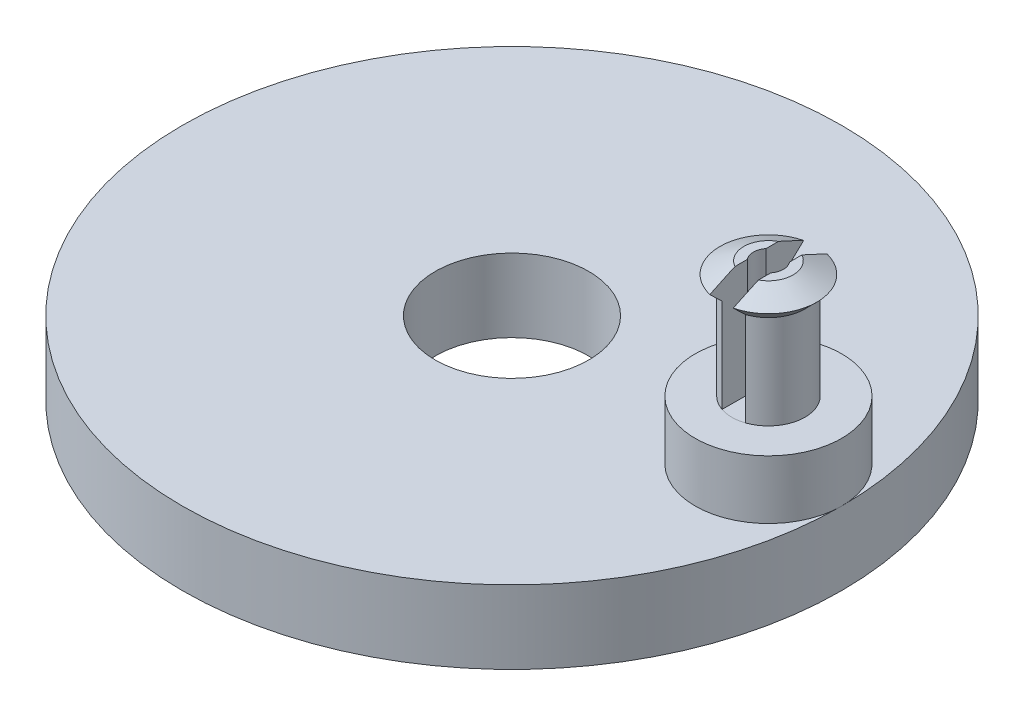
ISO-10303-21;
HEADER;
FILE_DESCRIPTION(('STEP AP214'),'2;1');
FILE_NAME('part.step','',(''),(''),'','','');
FILE_SCHEMA(('AUTOMOTIVE_DESIGN { 1 0 10303 214 1 1 1 1 }'));
ENDSEC;
DATA;
#1=APPLICATION_CONTEXT('core data for automotive mechanical design processes');
#2=APPLICATION_PROTOCOL_DEFINITION('international standard','automotive_design',2000,#1);
#3=PRODUCT_CONTEXT('',#1,'mechanical');
#4=PRODUCT('Part','Part','',(#3));
#5=PRODUCT_RELATED_PRODUCT_CATEGORY('part','',(#4));
#6=PRODUCT_DEFINITION_FORMATION('','',#4);
#7=PRODUCT_DEFINITION_CONTEXT('part definition',#1,'design');
#8=PRODUCT_DEFINITION('design','',#6,#7);
#9=PRODUCT_DEFINITION_SHAPE('','',#8);
#10=(LENGTH_UNIT() NAMED_UNIT(*) SI_UNIT(.MILLI.,.METRE.));
#11=(NAMED_UNIT(*) PLANE_ANGLE_UNIT() SI_UNIT($,.RADIAN.));
#12=(NAMED_UNIT(*) SI_UNIT($,.STERADIAN.) SOLID_ANGLE_UNIT());
#13=UNCERTAINTY_MEASURE_WITH_UNIT(LENGTH_MEASURE(1.E-05),#10,'distance_accuracy_value','');
#14=(GEOMETRIC_REPRESENTATION_CONTEXT(3) GLOBAL_UNCERTAINTY_ASSIGNED_CONTEXT((#13)) GLOBAL_UNIT_ASSIGNED_CONTEXT((#10,
#11,#12)) REPRESENTATION_CONTEXT('',''));
#15=CARTESIAN_POINT('',(0.,0.,0.));
#16=DIRECTION('',(0.,0.,1.));
#17=DIRECTION('',(1.,0.,0.));
#18=AXIS2_PLACEMENT_3D('',#15,#16,#17);
#19=CARTESIAN_POINT('',(11.1125,10.795,0.));
#20=DIRECTION('',(0.,-1.,0.));
#21=DIRECTION('',(0.,0.,-1.));
#22=AXIS2_PLACEMENT_3D('',#19,#20,#21);
#23=CONICAL_SURFACE('',#22,1.06838306981119,1.11024189471253);
#24=CARTESIAN_POINT('',(11.1125,10.2854067329982,0.));
#25=DIRECTION('',(0.,-1.,0.));
#26=DIRECTION('',(0.,0.,-1.));
#27=AXIS2_PLACEMENT_3D('',#24,#25,#26);
#28=CIRCLE('',#27,2.0955);
#29=CARTESIAN_POINT('',(11.6205,10.2854067329982,-2.03299194538493));
#30=VERTEX_POINT('',#29);
#31=CARTESIAN_POINT('',(11.6205,10.2854067329982,2.03299194538493));
#32=VERTEX_POINT('',#31);
#33=EDGE_CURVE('E272',#30,#32,#28,.T.);
#34=ORIENTED_EDGE('',*,*,#33,.F.);
#35=CARTESIAN_POINT('',(11.6205,10.2847067329982,-2.03444618888505));
#36=CARTESIAN_POINT('',(11.6205,10.333570793799,-1.93286572050983));
#37=CARTESIAN_POINT('',(11.6205,10.3823118411642,-1.83122531488033));
#38=CARTESIAN_POINT('',(11.6205,10.4792659184686,-1.6275870846532));
#39=CARTESIAN_POINT('',(11.6205,10.5274784630361,-1.52558902927974));
#40=CARTESIAN_POINT('',(11.6205,10.6269471427818,-1.31274399531558));
#41=CARTESIAN_POINT('',(11.6205,10.678126500503,-1.20186076137682));
#42=CARTESIAN_POINT('',(11.6205,10.753237891018,-1.03482340438307));
#43=CARTESIAN_POINT('',(11.6205,10.7779924345718,-0.979040344849807));
#44=CARTESIAN_POINT('',(11.6205,10.8266507037249,-0.867105619351564));
#45=CARTESIAN_POINT('',(11.6205,10.8505544787263,-0.810953975014432));
#46=CARTESIAN_POINT('',(11.6205,10.895177922838,-0.702529847055119));
#47=CARTESIAN_POINT('',(11.6205,10.9160001241908,-0.650299896386952));
#48=CARTESIAN_POINT('',(11.6205,10.9557888044178,-0.545060695002858));
#49=CARTESIAN_POINT('',(11.6205,10.9747533081388,-0.492050682305445));
#50=CARTESIAN_POINT('',(11.6205,11.0090157604214,-0.386392469416067));
#51=CARTESIAN_POINT('',(11.6205,11.0243980913441,-0.333772403737377));
#52=CARTESIAN_POINT('',(11.6205,11.0499059819571,-0.227285184285446));
#53=CARTESIAN_POINT('',(11.6205,11.0600430441358,-0.173421032218853));
#54=CARTESIAN_POINT('',(11.6205,11.0701590935038,-0.084083145820786));
#55=CARTESIAN_POINT('',(11.6205,11.0724686707629,-0.0488824873937726));
#56=CARTESIAN_POINT('',(11.6205,11.0734054733717,0.0215634040339679));
#57=CARTESIAN_POINT('',(11.6205,11.0720335771374,0.0568086243962584));
#58=CARTESIAN_POINT('',(11.6205,11.0658179915808,0.127249171188504));
#59=CARTESIAN_POINT('',(11.6205,11.0609476209143,0.162442018611823));
#60=CARTESIAN_POINT('',(11.6205,11.0483944055774,0.232328754243884));
#61=CARTESIAN_POINT('',(11.6205,11.0407094878879,0.267022255040229));
#62=CARTESIAN_POINT('',(11.6205,11.0238477215426,0.333624653460089));
#63=CARTESIAN_POINT('',(11.6205,11.0148010917834,0.365567430826599));
#64=CARTESIAN_POINT('',(11.6205,10.9953936809588,0.429054875353098));
#65=CARTESIAN_POINT('',(11.6205,10.9850325463566,0.46059943289285));
#66=CARTESIAN_POINT('',(11.6205,10.9525258759844,0.554814550505991));
#67=CARTESIAN_POINT('',(11.6205,10.928976804494,0.616996021917201));
#68=CARTESIAN_POINT('',(11.6205,10.8798120517533,0.74073216843469));
#69=CARTESIAN_POINT('',(11.6205,10.8541902835962,0.802284351897531));
#70=CARTESIAN_POINT('',(11.6205,10.8017790836246,0.924840876617647));
#71=CARTESIAN_POINT('',(11.6205,10.7749904210066,0.985845547728909));
#72=CARTESIAN_POINT('',(11.6205,10.720468891218,1.10799223700858));
#73=CARTESIAN_POINT('',(11.6205,10.6927303470935,1.16913170349966));
#74=CARTESIAN_POINT('',(11.6205,10.6367540273605,1.29119304744235));
#75=CARTESIAN_POINT('',(11.6205,10.6085161727665,1.35211488860228));
#76=CARTESIAN_POINT('',(11.6205,10.5233908644956,1.53445482063145));
#77=CARTESIAN_POINT('',(11.6205,10.4660044484333,1.65563962004577));
#78=CARTESIAN_POINT('',(11.6205,10.3877193745102,1.81974003583962));
#79=CARTESIAN_POINT('',(11.6205,10.3671230134028,1.86280089048256));
#80=CARTESIAN_POINT('',(11.6205,10.3259303739592,1.94872817670271));
#81=CARTESIAN_POINT('',(11.6205,10.3053343732938,1.99159474137553));
#82=CARTESIAN_POINT('',(11.6205,10.2847067329982,2.03444618888505));
#83=B_SPLINE_CURVE_WITH_KNOTS('',3,(#35,#36,#37,#38,#39,#40,#41,#42,#43,#44,#45,#46,#47,#48,#49,
#50,#51,#52,#53,#54,#55,#56,#57,#58,#59,#60,#61,#62,#63,#64,#65,#66,#67,#68,#69,#70,#71,#72,#73,
#74,#75,#76,#77,#78,#79,#80,#81,#82),.UNSPECIFIED.,.F.,.F.,(4,2,2,2,2,2,2,2,2,2,2,2,2,2,2,2,2,2,
2,2,2,2,2,4),(0.,0.338166972860301,0.676622130163528,1.04298101846566,1.22606388684639,
1.40913610663749,1.57779917604537,1.74663966915867,1.91097180659485,2.07494203196178,
2.18059199081132,2.28621674335168,2.39265572103193,2.49917325317483,2.59873405412885,
2.69832168900197,2.89771624429507,3.09771924459875,3.29759234454449,3.49900254295994,
3.70044489247477,4.1026961712963,4.24589547287104,4.38856869846006),.UNSPECIFIED.);
#84=CARTESIAN_POINT('',(11.6205,10.795,-0.939882111681667));
#85=VERTEX_POINT('',#84);
#86=EDGE_CURVE('E360',#30,#85,#83,.T.);
#87=ORIENTED_EDGE('',*,*,#86,.T.);
#88=CARTESIAN_POINT('',(11.1125,10.795,0.));
#89=DIRECTION('',(0.,-1.,0.));
#90=DIRECTION('',(0.,0.,-1.));
#91=AXIS2_PLACEMENT_3D('',#88,#89,#90);
#92=CIRCLE('',#91,1.06838306981119);
#93=CARTESIAN_POINT('',(11.6205,10.795,0.939882111681667));
#94=VERTEX_POINT('',#93);
#95=EDGE_CURVE('E286',#85,#94,#92,.T.);
#96=ORIENTED_EDGE('',*,*,#95,.T.);
#97=EDGE_CURVE('E350',#94,#32,#83,.T.);
#98=ORIENTED_EDGE('',*,*,#97,.T.);
#99=EDGE_LOOP('',(#34,#87,#96,#98));
#100=FACE_BOUND('',#99,.T.);
#101=ADVANCED_FACE('F39',(#100),#23,.T.);
#102=CARTESIAN_POINT('',(11.1125,10.2854067329982,0.));
#103=DIRECTION('',(0.,1.,0.));
#104=DIRECTION('',(0.,0.,1.));
#105=AXIS2_PLACEMENT_3D('',#102,#103,#104);
#106=CONICAL_SURFACE('',#105,2.0955,0.786968801327761);
#107=ORIENTED_EDGE('',*,*,#33,.T.);
#108=CARTESIAN_POINT('',(11.6205,10.2861067329982,2.03371573066489));
#109=CARTESIAN_POINT('',(11.6205,10.2391831440636,1.98519593448692));
#110=CARTESIAN_POINT('',(11.6205,10.1923080827223,1.9366290154971));
#111=CARTESIAN_POINT('',(11.6205,10.0986846424886,1.83937169207284));
#112=CARTESIAN_POINT('',(11.6205,10.0519362657207,1.79068128559375));
#113=CARTESIAN_POINT('',(11.6205,9.91185417935172,1.64430631760241));
#114=CARTESIAN_POINT('',(11.6205,9.81875778289134,1.54639461348666));
#115=CARTESIAN_POINT('',(11.6205,9.6318945900217,1.34776583074746));
#116=CARTESIAN_POINT('',(11.6205,9.5381472007048,1.24703034745993));
#117=CARTESIAN_POINT('',(11.6205,9.39915126609169,1.09447892296673));
#118=CARTESIAN_POINT('',(11.6205,9.35309876682968,1.04339695323211));
#119=CARTESIAN_POINT('',(11.6205,9.26180541906299,0.940514371707628));
#120=CARTESIAN_POINT('',(11.6205,9.21656451629374,0.888713808377776));
#121=CARTESIAN_POINT('',(11.6205,9.14250236684547,0.801782890584742));
#122=CARTESIAN_POINT('',(11.6205,9.11331948933075,0.766961429899956));
#123=CARTESIAN_POINT('',(11.6205,9.05574057156134,0.696651836918109));
#124=CARTESIAN_POINT('',(11.6205,9.02734478007161,0.661163499663936));
#125=CARTESIAN_POINT('',(11.6205,8.97178459194898,0.589352163528586));
#126=CARTESIAN_POINT('',(11.6205,8.94461766558819,0.553031135228383));
#127=CARTESIAN_POINT('',(11.6205,8.89209778401023,0.479110630019341));
#128=CARTESIAN_POINT('',(11.6205,8.86674372129378,0.441511954715621));
#129=CARTESIAN_POINT('',(11.6205,8.82180033906405,0.368968513404946));
#130=CARTESIAN_POINT('',(11.6205,8.80188367532777,0.334229984325404));
#131=CARTESIAN_POINT('',(11.6205,8.7658136403258,0.262807668487352));
#132=CARTESIAN_POINT('',(11.6205,8.7496562890096,0.22612598997191));
#133=CARTESIAN_POINT('',(11.6205,8.72621969050067,0.158457620437535));
#134=CARTESIAN_POINT('',(11.6205,8.71779008193544,0.127885731792567));
#135=CARTESIAN_POINT('',(11.6205,8.70621967661815,0.0657938225693621));
#136=CARTESIAN_POINT('',(11.6205,8.70306217973946,0.034277118993749));
#137=CARTESIAN_POINT('',(11.6205,8.70272330050501,-0.0289158865190598));
#138=CARTESIAN_POINT('',(11.6205,8.70556567509996,-0.0605923256015666));
#139=CARTESIAN_POINT('',(11.6205,8.71661225688154,-0.123021171580938));
#140=CARTESIAN_POINT('',(11.6205,8.72483102904133,-0.153770830382573));
#141=CARTESIAN_POINT('',(11.6205,8.74599263395935,-0.216183189465512));
#142=CARTESIAN_POINT('',(11.6205,8.75924995453181,-0.2477344704047));
#143=CARTESIAN_POINT('',(11.6205,8.78880538126506,-0.309403706506788));
#144=CARTESIAN_POINT('',(11.6205,8.80510934794674,-0.339518756393992));
#145=CARTESIAN_POINT('',(11.6205,8.83984568622969,-0.39880345938415));
#146=CARTESIAN_POINT('',(11.6205,8.85829429441422,-0.427963427971164));
#147=CARTESIAN_POINT('',(11.6205,8.89653361729393,-0.485339790479753));
#148=CARTESIAN_POINT('',(11.6205,8.91632308988147,-0.51355702247519));
#149=CARTESIAN_POINT('',(11.6205,8.95874739121341,-0.571914746291205));
#150=CARTESIAN_POINT('',(11.6205,8.98147498767663,-0.601987332617881));
#151=CARTESIAN_POINT('',(11.6205,9.0277245800409,-0.661517424187673));
#152=CARTESIAN_POINT('',(11.6205,9.0512466793402,-0.690974848558765));
#153=CARTESIAN_POINT('',(11.6205,9.12268257028246,-0.778681568791406));
#154=CARTESIAN_POINT('',(11.6205,9.1714450280798,-0.836237485046786));
#155=CARTESIAN_POINT('',(11.6205,9.27032415026797,-0.950330846226255));
#156=CARTESIAN_POINT('',(11.6205,9.32044296906357,-1.0068664003797));
#157=CARTESIAN_POINT('',(11.6205,9.42147504696845,-1.11919366675139));
#158=CARTESIAN_POINT('',(11.6205,9.47238808238651,-1.17498558049021));
#159=CARTESIAN_POINT('',(11.6205,9.57458586586735,-1.28589587191143));
#160=CARTESIAN_POINT('',(11.6205,9.62586889806846,-1.3410158358787));
#161=CARTESIAN_POINT('',(11.6205,9.72881339353525,-1.45090790706735));
#162=CARTESIAN_POINT('',(11.6205,9.78047488254632,-1.50567999014115));
#163=CARTESIAN_POINT('',(11.6205,9.93578448855455,-1.66953327861249));
#164=CARTESIAN_POINT('',(11.6205,10.0398341198792,-1.77823370067565));
#165=CARTESIAN_POINT('',(11.6205,10.167808792583,-1.91117949371458));
#166=CARTESIAN_POINT('',(11.6205,10.1914458566905,-1.93570352301899));
#167=CARTESIAN_POINT('',(11.6205,10.2387530537852,-1.98472791212922));
#168=CARTESIAN_POINT('',(11.6205,10.2624231918129,-2.00922826707115));
#169=CARTESIAN_POINT('',(11.6205,10.2861067329982,-2.03371573066489));
#170=B_SPLINE_CURVE_WITH_KNOTS('',3,(#108,#109,#110,#111,#112,#113,#114,#115,#116,#117,#118,
#119,#120,#121,#122,#123,#124,#125,#126,#127,#128,#129,#130,#131,#132,#133,#134,#135,#136,#137,
#138,#139,#140,#141,#142,#143,#144,#145,#146,#147,#148,#149,#150,#151,#152,#153,#154,#155,#156,
#157,#158,#159,#160,#161,#162,#163,#164,#165,#166,#167,#168,#169),.UNSPECIFIED.,.F.,.F.,(4,2,2,
2,2,2,2,2,2,2,2,2,2,2,2,2,2,2,2,2,2,2,2,2,2,2,2,2,2,2,4),(0.,0.202494492557057,
0.404992360095032,0.810308181472409,1.22311463361278,1.4294392431596,1.63575000572656,
1.77204186855466,1.90837632740143,2.04441600888086,2.18037185922292,2.30037547247225,
2.42025145170826,2.5150390306853,2.6095257835775,2.70438736564834,2.79950700347133,
2.90193612341352,3.00456434277523,3.10802749650799,3.21139608413516,3.32446186102749,
3.43754240966561,3.6638078732506,3.89045668939248,4.11704278289128,4.34290216730352,
4.56877706169052,5.02019030179422,5.12237276440143,5.22457301597904),.UNSPECIFIED.);
#171=CARTESIAN_POINT('',(11.6205,9.779,1.50402534885553));
#172=VERTEX_POINT('',#171);
#173=EDGE_CURVE('E351',#32,#172,#170,.T.);
#174=ORIENTED_EDGE('',*,*,#173,.T.);
#175=CARTESIAN_POINT('',(11.1125,9.779,0.));
#176=DIRECTION('',(0.,-1.,0.));
#177=DIRECTION('',(0.,0.,-1.));
#178=AXIS2_PLACEMENT_3D('',#175,#176,#177);
#179=CIRCLE('',#178,1.5875);
#180=CARTESIAN_POINT('',(11.6205,9.779,-1.50402534885553));
#181=VERTEX_POINT('',#180);
#182=EDGE_CURVE('E276',#181,#172,#179,.T.);
#183=ORIENTED_EDGE('',*,*,#182,.F.);
#184=EDGE_CURVE('E368',#181,#30,#170,.T.);
#185=ORIENTED_EDGE('',*,*,#184,.T.);
#186=EDGE_LOOP('',(#107,#174,#183,#185));
#187=FACE_BOUND('',#186,.T.);
#188=ADVANCED_FACE('F435',(#187),#106,.T.);
#189=CARTESIAN_POINT('',(11.1125,3.175,0.));
#190=DIRECTION('',(0.,-1.,0.));
#191=DIRECTION('',(0.,0.,-1.));
#192=AXIS2_PLACEMENT_3D('',#189,#190,#191);
#193=CYLINDRICAL_SURFACE('',#192,1.5875);
#194=ORIENTED_EDGE('',*,*,#182,.T.);
#195=DIRECTION('',(0.,-1.,0.));
#196=VECTOR('',#195,1.);
#197=CARTESIAN_POINT('',(11.6205,3.175,1.50402534885553));
#198=LINE('',#197,#196);
#199=CARTESIAN_POINT('',(11.6204908399416,5.71092127573175,1.50405849005337));
#200=VERTEX_POINT('',#199);
#201=EDGE_CURVE('E364',#172,#200,#198,.T.);
#202=ORIENTED_EDGE('',*,*,#201,.T.);
#203=CARTESIAN_POINT('',(11.1125,5.715,0.));
#204=DIRECTION('',(0.,-1.,0.));
#205=DIRECTION('',(0.,0.,-1.));
#206=AXIS2_PLACEMENT_3D('',#203,#204,#205);
#207=CIRCLE('',#206,1.5875);
#208=CARTESIAN_POINT('',(11.6204943975401,5.71091753510502,-1.504045667974));
#209=VERTEX_POINT('',#208);
#210=EDGE_CURVE('E190',#209,#200,#207,.T.);
#211=ORIENTED_EDGE('',*,*,#210,.F.);
#212=DIRECTION('',(0.,-1.,0.));
#213=VECTOR('',#212,1.);
#214=CARTESIAN_POINT('',(11.6205,3.175,-1.50402534885553));
#215=LINE('',#214,#213);
#216=EDGE_CURVE('E159',#209,#181,#215,.F.);
#217=ORIENTED_EDGE('',*,*,#216,.T.);
#218=EDGE_LOOP('',(#194,#202,#211,#217));
#219=FACE_BOUND('',#218,.T.);
#220=ADVANCED_FACE('F436',(#219),#193,.T.);
#221=CARTESIAN_POINT('',(10.0441169301888,10.795,0.));
#222=DIRECTION('',(0.,-1.,0.));
#223=DIRECTION('',(0.,0.,-1.));
#224=AXIS2_PLACEMENT_3D('',#221,#222,#223);
#225=PLANE('',#224);
#226=ORIENTED_EDGE('',*,*,#95,.F.);
#227=DIRECTION('',(0.,0.,1.));
#228=VECTOR('',#227,1.);
#229=CARTESIAN_POINT('',(11.6205,10.795,0.));
#230=LINE('',#229,#228);
#231=CARTESIAN_POINT('',(11.6205,10.795,-0.404663408831457));
#232=VERTEX_POINT('',#231);
#233=EDGE_CURVE('E255',#85,#232,#230,.T.);
#234=ORIENTED_EDGE('',*,*,#233,.T.);
#235=CARTESIAN_POINT('',(11.1125,10.795,0.));
#236=DIRECTION('',(0.,-1.,0.));
#237=DIRECTION('',(0.,0.,-1.));
#238=AXIS2_PLACEMENT_3D('',#235,#236,#237);
#239=CIRCLE('',#238,0.649473998284068);
#240=CARTESIAN_POINT('',(11.6205,10.795,0.404663408831457));
#241=VERTEX_POINT('',#240);
#242=EDGE_CURVE('E284',#232,#241,#239,.T.);
#243=ORIENTED_EDGE('',*,*,#242,.T.);
#244=EDGE_CURVE('E254',#241,#94,#230,.T.);
#245=ORIENTED_EDGE('',*,*,#244,.T.);
#246=EDGE_LOOP('',(#226,#234,#243,#245));
#247=FACE_BOUND('',#246,.T.);
#248=ADVANCED_FACE('F390',(#247),#225,.F.);
#249=CARTESIAN_POINT('',(0.,3.175,0.));
#250=DIRECTION('',(0.,1.,0.));
#251=DIRECTION('',(0.,0.,1.));
#252=AXIS2_PLACEMENT_3D('',#249,#250,#251);
#253=PLANE('',#252);
#254=CARTESIAN_POINT('',(0.,3.175,0.));
#255=DIRECTION('',(0.,1.,0.));
#256=DIRECTION('',(0.,0.,1.));
#257=AXIS2_PLACEMENT_3D('',#254,#255,#256);
#258=CIRCLE('',#257,14.2875);
#259=CARTESIAN_POINT('',(14.2875,3.175,0.));
#260=VERTEX_POINT('',#259);
#261=EDGE_CURVE('E266',#260,#260,#258,.T.);
#262=ORIENTED_EDGE('',*,*,#261,.T.);
#263=CARTESIAN_POINT('',(11.1125,3.175,0.));
#264=DIRECTION('',(0.,-1.,0.));
#265=DIRECTION('',(0.,0.,-1.));
#266=AXIS2_PLACEMENT_3D('',#263,#264,#265);
#267=CIRCLE('',#266,3.175);
#268=EDGE_CURVE('E236',#260,#260,#267,.T.);
#269=ORIENTED_EDGE('',*,*,#268,.T.);
#270=EDGE_LOOP('',(#262,#269));
#271=FACE_BOUND('',#270,.T.);
#272=CARTESIAN_POINT('',(0.,3.175,0.));
#273=DIRECTION('',(0.,1.,0.));
#274=DIRECTION('',(0.,0.,1.));
#275=AXIS2_PLACEMENT_3D('',#272,#273,#274);
#276=CIRCLE('',#275,3.3274);
#277=CARTESIAN_POINT('',(0.,3.175,3.3274));
#278=VERTEX_POINT('',#277);
#279=EDGE_CURVE('E270',#278,#278,#276,.T.);
#280=ORIENTED_EDGE('',*,*,#279,.F.);
#281=EDGE_LOOP('',(#280));
#282=FACE_BOUND('',#281,.T.);
#283=ADVANCED_FACE('F427',(#271,#282),#253,.T.);
#284=CARTESIAN_POINT('',(0.,0.,0.));
#285=DIRECTION('',(0.,1.,0.));
#286=DIRECTION('',(0.,0.,1.));
#287=AXIS2_PLACEMENT_3D('',#284,#285,#286);
#288=PLANE('',#287);
#289=CARTESIAN_POINT('',(0.,0.,0.));
#290=DIRECTION('',(0.,1.,0.));
#291=DIRECTION('',(0.,0.,1.));
#292=AXIS2_PLACEMENT_3D('',#289,#290,#291);
#293=CIRCLE('',#292,14.2875);
#294=CARTESIAN_POINT('',(0.,0.,14.2875));
#295=VERTEX_POINT('',#294);
#296=EDGE_CURVE('E263',#295,#295,#293,.T.);
#297=ORIENTED_EDGE('',*,*,#296,.F.);
#298=EDGE_LOOP('',(#297));
#299=FACE_BOUND('',#298,.T.);
#300=CARTESIAN_POINT('',(0.,0.,0.));
#301=DIRECTION('',(0.,1.,0.));
#302=DIRECTION('',(0.,0.,1.));
#303=AXIS2_PLACEMENT_3D('',#300,#301,#302);
#304=CIRCLE('',#303,3.3274);
#305=CARTESIAN_POINT('',(0.,0.,3.3274));
#306=VERTEX_POINT('',#305);
#307=EDGE_CURVE('E269',#306,#306,#304,.T.);
#308=ORIENTED_EDGE('',*,*,#307,.T.);
#309=EDGE_LOOP('',(#308));
#310=FACE_BOUND('',#309,.T.);
#311=ADVANCED_FACE('F567',(#299,#310),#288,.F.);
#312=CARTESIAN_POINT('',(0.,3.175,0.));
#313=DIRECTION('',(0.,-1.,0.));
#314=DIRECTION('',(0.,0.,-1.));
#315=AXIS2_PLACEMENT_3D('',#312,#313,#314);
#316=CYLINDRICAL_SURFACE('',#315,14.2875);
#317=ORIENTED_EDGE('',*,*,#261,.F.);
#318=EDGE_LOOP('',(#317));
#319=FACE_BOUND('',#318,.T.);
#320=ORIENTED_EDGE('',*,*,#296,.T.);
#321=EDGE_LOOP('',(#320));
#322=FACE_BOUND('',#321,.T.);
#323=ADVANCED_FACE('F41',(#319,#322),#316,.T.);
#324=CARTESIAN_POINT('',(0.,3.175,0.));
#325=DIRECTION('',(0.,-1.,0.));
#326=DIRECTION('',(0.,0.,-1.));
#327=AXIS2_PLACEMENT_3D('',#324,#325,#326);
#328=CYLINDRICAL_SURFACE('',#327,3.3274);
#329=ORIENTED_EDGE('',*,*,#279,.T.);
#330=EDGE_LOOP('',(#329));
#331=FACE_BOUND('',#330,.T.);
#332=ORIENTED_EDGE('',*,*,#307,.F.);
#333=EDGE_LOOP('',(#332));
#334=FACE_BOUND('',#333,.T.);
#335=ADVANCED_FACE('F342',(#331,#334),#328,.F.);
#336=CARTESIAN_POINT('',(10.6045,10.2854067329982,2.03299194538493));
#337=VERTEX_POINT('',#336);
#338=CARTESIAN_POINT('',(10.6045,10.2854067329982,-2.03299194538493));
#339=VERTEX_POINT('',#338);
#340=EDGE_CURVE('E279',#337,#339,#28,.T.);
#341=ORIENTED_EDGE('',*,*,#340,.F.);
#342=CARTESIAN_POINT('',(10.6045,10.2847067329982,2.03444618888504));
#343=CARTESIAN_POINT('',(10.6045,10.333570793799,1.93286572050983));
#344=CARTESIAN_POINT('',(10.6045,10.3823118411642,1.83122531488033));
#345=CARTESIAN_POINT('',(10.6045,10.4792659184686,1.6275870846532));
#346=CARTESIAN_POINT('',(10.6045,10.5274784630361,1.52558902927974));
#347=CARTESIAN_POINT('',(10.6045,10.6269471427818,1.31274399531558));
#348=CARTESIAN_POINT('',(10.6045,10.678126500503,1.20186076137683));
#349=CARTESIAN_POINT('',(10.6045,10.753237891018,1.03482340438307));
#350=CARTESIAN_POINT('',(10.6045,10.7779924345718,0.979040344849808));
#351=CARTESIAN_POINT('',(10.6045,10.8266507037249,0.867105619351565));
#352=CARTESIAN_POINT('',(10.6045,10.8505544787263,0.810953975014434));
#353=CARTESIAN_POINT('',(10.6045,10.895177922838,0.70252984705512));
#354=CARTESIAN_POINT('',(10.6045,10.9160001241908,0.650299896386953));
#355=CARTESIAN_POINT('',(10.6045,10.9557888044178,0.545060695002859));
#356=CARTESIAN_POINT('',(10.6045,10.9747533081388,0.492050682305447));
#357=CARTESIAN_POINT('',(10.6045,11.0090157604214,0.386392469416069));
#358=CARTESIAN_POINT('',(10.6045,11.0243980913441,0.333772403737378));
#359=CARTESIAN_POINT('',(10.6045,11.0499059819571,0.227285184285448));
#360=CARTESIAN_POINT('',(10.6045,11.0600430441358,0.173421032218853));
#361=CARTESIAN_POINT('',(10.6045,11.0701590935038,0.0840831458207863));
#362=CARTESIAN_POINT('',(10.6045,11.0724686707629,0.0488824873937727));
#363=CARTESIAN_POINT('',(10.6045,11.0734054733717,-0.0215634040339682));
#364=CARTESIAN_POINT('',(10.6045,11.0720335771374,-0.0568086243962589));
#365=CARTESIAN_POINT('',(10.6045,11.0658179915808,-0.127249171188504));
#366=CARTESIAN_POINT('',(10.6045,11.0609476209143,-0.162442018611823));
#367=CARTESIAN_POINT('',(10.6045,11.0483944055774,-0.232328754243885));
#368=CARTESIAN_POINT('',(10.6045,11.0407094878879,-0.26702225504023));
#369=CARTESIAN_POINT('',(10.6045,11.0238477215426,-0.333624653460091));
#370=CARTESIAN_POINT('',(10.6045,11.0148010917834,-0.365567430826601));
#371=CARTESIAN_POINT('',(10.6045,10.9953936809588,-0.4290548753531));
#372=CARTESIAN_POINT('',(10.6045,10.9850325463566,-0.460599432892853));
#373=CARTESIAN_POINT('',(10.6045,10.9525258759844,-0.554814550505995));
#374=CARTESIAN_POINT('',(10.6045,10.928976804494,-0.616996021917204));
#375=CARTESIAN_POINT('',(10.6045,10.8798120517533,-0.740732168434694));
#376=CARTESIAN_POINT('',(10.6045,10.8541902835962,-0.802284351897536));
#377=CARTESIAN_POINT('',(10.6045,10.8017790836246,-0.924840876617652));
#378=CARTESIAN_POINT('',(10.6045,10.7749904210066,-0.985845547728913));
#379=CARTESIAN_POINT('',(10.6045,10.720468891218,-1.10799223700858));
#380=CARTESIAN_POINT('',(10.6045,10.6927303470935,-1.16913170349967));
#381=CARTESIAN_POINT('',(10.6045,10.6367540273605,-1.29119304744236));
#382=CARTESIAN_POINT('',(10.6045,10.6085161727665,-1.35211488860229));
#383=CARTESIAN_POINT('',(10.6045,10.5233908644956,-1.53445482063146));
#384=CARTESIAN_POINT('',(10.6045,10.4660044484333,-1.65563962004578));
#385=CARTESIAN_POINT('',(10.6045,10.3877193745102,-1.81974003583962));
#386=CARTESIAN_POINT('',(10.6045,10.3671230134028,-1.86280089048256));
#387=CARTESIAN_POINT('',(10.6045,10.3259303739592,-1.94872817670271));
#388=CARTESIAN_POINT('',(10.6045,10.3053343732938,-1.99159474137553));
#389=CARTESIAN_POINT('',(10.6045,10.2847067329982,-2.03444618888504));
#390=B_SPLINE_CURVE_WITH_KNOTS('',3,(#342,#343,#344,#345,#346,#347,#348,#349,#350,#351,#352,
#353,#354,#355,#356,#357,#358,#359,#360,#361,#362,#363,#364,#365,#366,#367,#368,#369,#370,#371,
#372,#373,#374,#375,#376,#377,#378,#379,#380,#381,#382,#383,#384,#385,#386,#387,#388,#389),
.UNSPECIFIED.,.F.,.F.,(4,2,2,2,2,2,2,2,2,2,2,2,2,2,2,2,2,2,2,2,2,2,2,4),(0.,0.338166972860301,
0.676622130163527,1.04298101846566,1.22606388684638,1.40913610663749,1.57779917604537,
1.74663966915866,1.91097180659485,2.07494203196178,2.18059199081132,2.28621674335168,
2.39265572103193,2.49917325317483,2.59873405412885,2.69832168900197,2.89771624429508,
3.09771924459875,3.29759234454449,3.49900254295994,3.70044489247478,4.1026961712963,
4.24589547287104,4.38856869846006),.UNSPECIFIED.);
#391=CARTESIAN_POINT('',(10.6045,10.795,0.939882111681665));
#392=VERTEX_POINT('',#391);
#393=EDGE_CURVE('E331',#337,#392,#390,.T.);
#394=ORIENTED_EDGE('',*,*,#393,.T.);
#395=CARTESIAN_POINT('',(10.6045,10.795,-0.939882111681665));
#396=VERTEX_POINT('',#395);
#397=EDGE_CURVE('E291',#392,#396,#92,.T.);
#398=ORIENTED_EDGE('',*,*,#397,.T.);
#399=EDGE_CURVE('E326',#396,#339,#390,.T.);
#400=ORIENTED_EDGE('',*,*,#399,.T.);
#401=EDGE_LOOP('',(#341,#394,#398,#400));
#402=FACE_BOUND('',#401,.T.);
#403=ADVANCED_FACE('F337',(#402),#23,.T.);
#404=ORIENTED_EDGE('',*,*,#340,.T.);
#405=CARTESIAN_POINT('',(10.6045,10.2861067329982,-2.03371573066489));
#406=CARTESIAN_POINT('',(10.6045,10.2391831440636,-1.98519593448692));
#407=CARTESIAN_POINT('',(10.6045,10.1923080827223,-1.9366290154971));
#408=CARTESIAN_POINT('',(10.6045,10.0986846424886,-1.83937169207284));
#409=CARTESIAN_POINT('',(10.6045,10.0519362657207,-1.79068128559375));
#410=CARTESIAN_POINT('',(10.6045,9.91185417935173,-1.64430631760241));
#411=CARTESIAN_POINT('',(10.6045,9.81875778289134,-1.54639461348666));
#412=CARTESIAN_POINT('',(10.6045,9.63189459002171,-1.34776583074746));
#413=CARTESIAN_POINT('',(10.6045,9.5381472007048,-1.24703034745994));
#414=CARTESIAN_POINT('',(10.6045,9.39915126609169,-1.09447892296673));
#415=CARTESIAN_POINT('',(10.6045,9.35309876682969,-1.04339695323211));
#416=CARTESIAN_POINT('',(10.6045,9.261805419063,-0.940514371707635));
#417=CARTESIAN_POINT('',(10.6045,9.21656451629375,-0.888713808377783));
#418=CARTESIAN_POINT('',(10.6045,9.14250236684548,-0.801782890584751));
#419=CARTESIAN_POINT('',(10.6045,9.11331948933075,-0.766961429899964));
#420=CARTESIAN_POINT('',(10.6045,9.05574057156135,-0.696651836918118));
#421=CARTESIAN_POINT('',(10.6045,9.02734478007162,-0.661163499663945));
#422=CARTESIAN_POINT('',(10.6045,8.97178459194899,-0.589352163528597));
#423=CARTESIAN_POINT('',(10.6045,8.9446176655882,-0.553031135228394));
#424=CARTESIAN_POINT('',(10.6045,8.89209778401024,-0.479110630019353));
#425=CARTESIAN_POINT('',(10.6045,8.86674372129379,-0.441511954715634));
#426=CARTESIAN_POINT('',(10.6045,8.82180033906406,-0.368968513404958));
#427=CARTESIAN_POINT('',(10.6045,8.80188367532778,-0.334229984325415));
#428=CARTESIAN_POINT('',(10.6045,8.76581364032581,-0.262807668487363));
#429=CARTESIAN_POINT('',(10.6045,8.74965628900961,-0.22612598997192));
#430=CARTESIAN_POINT('',(10.6045,8.72621969050067,-0.158457620437544));
#431=CARTESIAN_POINT('',(10.6045,8.71779008193545,-0.127885731792577));
#432=CARTESIAN_POINT('',(10.6045,8.70621967661815,-0.0657938225693707));
#433=CARTESIAN_POINT('',(10.6045,8.70306217973947,-0.0342771189937571));
#434=CARTESIAN_POINT('',(10.6045,8.70272330050501,0.0289158865190526));
#435=CARTESIAN_POINT('',(10.6045,8.70556567509996,0.0605923256015598));
#436=CARTESIAN_POINT('',(10.6045,8.71661225688154,0.123021171580932));
#437=CARTESIAN_POINT('',(10.6045,8.72483102904133,0.153770830382568));
#438=CARTESIAN_POINT('',(10.6045,8.74599263395935,0.216183189465506));
#439=CARTESIAN_POINT('',(10.6045,8.75924995453181,0.247734470404693));
#440=CARTESIAN_POINT('',(10.6045,8.78880538126506,0.30940370650678));
#441=CARTESIAN_POINT('',(10.6045,8.80510934794674,0.339518756393983));
#442=CARTESIAN_POINT('',(10.6045,8.83984568622969,0.39880345938414));
#443=CARTESIAN_POINT('',(10.6045,8.85829429441421,0.427963427971153));
#444=CARTESIAN_POINT('',(10.6045,8.89653361729393,0.485339790479741));
#445=CARTESIAN_POINT('',(10.6045,8.91632308988146,0.513557022475178));
#446=CARTESIAN_POINT('',(10.6045,8.9587473912134,0.571914746291192));
#447=CARTESIAN_POINT('',(10.6045,8.98147498767662,0.601987332617867));
#448=CARTESIAN_POINT('',(10.6045,9.02772458004089,0.661517424187657));
#449=CARTESIAN_POINT('',(10.6045,9.05124667934019,0.690974848558748));
#450=CARTESIAN_POINT('',(10.6045,9.12268257028244,0.778681568791387));
#451=CARTESIAN_POINT('',(10.6045,9.17144502807979,0.836237485046765));
#452=CARTESIAN_POINT('',(10.6045,9.27032415026795,0.950330846226231));
#453=CARTESIAN_POINT('',(10.6045,9.32044296906355,1.00686640037967));
#454=CARTESIAN_POINT('',(10.6045,9.42147504696842,1.11919366675136));
#455=CARTESIAN_POINT('',(10.6045,9.47238808238648,1.17498558049018));
#456=CARTESIAN_POINT('',(10.6045,9.57458586586732,1.28589587191139));
#457=CARTESIAN_POINT('',(10.6045,9.62586889806842,1.34101583587866));
#458=CARTESIAN_POINT('',(10.6045,9.72881339353522,1.45090790706731));
#459=CARTESIAN_POINT('',(10.6045,9.78047488254628,1.5056799901411));
#460=CARTESIAN_POINT('',(10.6045,9.93578448855451,1.66953327861245));
#461=CARTESIAN_POINT('',(10.6045,10.0398341198792,1.7782337006756));
#462=CARTESIAN_POINT('',(10.6045,10.1678087925829,1.91117949371454));
#463=CARTESIAN_POINT('',(10.6045,10.1914458566905,1.93570352301895));
#464=CARTESIAN_POINT('',(10.6045,10.2387530537852,1.9847279121292));
#465=CARTESIAN_POINT('',(10.6045,10.2624231918129,2.00922826707114));
#466=CARTESIAN_POINT('',(10.6045,10.2861067329982,2.03371573066489));
#467=B_SPLINE_CURVE_WITH_KNOTS('',3,(#405,#406,#407,#408,#409,#410,#411,#412,#413,#414,#415,
#416,#417,#418,#419,#420,#421,#422,#423,#424,#425,#426,#427,#428,#429,#430,#431,#432,#433,#434,
#435,#436,#437,#438,#439,#440,#441,#442,#443,#444,#445,#446,#447,#448,#449,#450,#451,#452,#453,
#454,#455,#456,#457,#458,#459,#460,#461,#462,#463,#464,#465,#466),.UNSPECIFIED.,.F.,.F.,(4,2,2,
2,2,2,2,2,2,2,2,2,2,2,2,2,2,2,2,2,2,2,2,2,2,2,2,2,2,2,4),(0.,0.202494492557057,
0.404992360095029,0.810308181472402,1.22311463361277,1.42943924315959,1.63575000572654,
1.77204186855465,1.90837632740142,2.04441600888084,2.18037185922291,2.30037547247223,
2.42025145170825,2.51503903068529,2.60952578357749,2.70438736564833,2.79950700347132,
2.90193612341351,3.00456434277521,3.10802749650797,3.21139608413514,3.32446186102747,
3.43754240966558,3.66380787325057,3.89045668939244,4.11704278289123,4.34290216730347,
4.56877706169046,5.02019030179415,5.12237276440139,5.22457301597904),.UNSPECIFIED.);
#468=CARTESIAN_POINT('',(10.6045,9.779,-1.50402534885553));
#469=VERTEX_POINT('',#468);
#470=EDGE_CURVE('E181',#339,#469,#467,.T.);
#471=ORIENTED_EDGE('',*,*,#470,.T.);
#472=CARTESIAN_POINT('',(10.6045,9.779,1.50402534885553));
#473=VERTEX_POINT('',#472);
#474=EDGE_CURVE('E182',#473,#469,#179,.T.);
#475=ORIENTED_EDGE('',*,*,#474,.F.);
#476=EDGE_CURVE('E397',#473,#337,#467,.T.);
#477=ORIENTED_EDGE('',*,*,#476,.T.);
#478=EDGE_LOOP('',(#404,#471,#475,#477));
#479=FACE_BOUND('',#478,.T.);
#480=ADVANCED_FACE('F336',(#479),#106,.T.);
#481=ORIENTED_EDGE('',*,*,#474,.T.);
#482=DIRECTION('',(0.,-1.,0.));
#483=VECTOR('',#482,1.);
#484=CARTESIAN_POINT('',(10.6045,3.175,-1.50402534885553));
#485=LINE('',#484,#483);
#486=CARTESIAN_POINT('',(10.6045095414005,5.71092167627544,-1.50405996575236));
#487=VERTEX_POINT('',#486);
#488=EDGE_CURVE('E167',#469,#487,#485,.T.);
#489=ORIENTED_EDGE('',*,*,#488,.T.);
#490=CARTESIAN_POINT('',(10.6045060039657,5.71091795761715,1.50404709404881));
#491=VERTEX_POINT('',#490);
#492=EDGE_CURVE('E178',#491,#487,#207,.T.);
#493=ORIENTED_EDGE('',*,*,#492,.F.);
#494=DIRECTION('',(0.,-1.,0.));
#495=VECTOR('',#494,1.);
#496=CARTESIAN_POINT('',(10.6045,3.175,1.50402534885553));
#497=LINE('',#496,#495);
#498=EDGE_CURVE('E391',#491,#473,#497,.F.);
#499=ORIENTED_EDGE('',*,*,#498,.T.);
#500=EDGE_LOOP('',(#481,#489,#493,#499));
#501=FACE_BOUND('',#500,.T.);
#502=ADVANCED_FACE('F177',(#501),#193,.T.);
#503=CARTESIAN_POINT('',(7.9375,5.715,0.));
#504=DIRECTION('',(0.,-1.,0.));
#505=DIRECTION('',(0.,0.,-1.));
#506=AXIS2_PLACEMENT_3D('',#503,#504,#505);
#507=PLANE('',#506);
#508=CARTESIAN_POINT('',(10.6045190360256,5.715,-1.50403177833436));
#509=CARTESIAN_POINT('',(11.112504371219,5.715,-1.67560187676817));
#510=CARTESIAN_POINT('',(11.62048881124,5.715,-1.50402912792771));
#511=B_SPLINE_CURVE_WITH_KNOTS('',2,(#508,#509,#510),.UNSPECIFIED.,.F.,.F.,(3,3),(0.,1.),.UNSPECIFIED.);
#512=EDGE_CURVE('E150',#487,#209,#511,.T.);
#513=ORIENTED_EDGE('',*,*,#512,.T.);
#514=ORIENTED_EDGE('',*,*,#210,.T.);
#515=CARTESIAN_POINT('',(11.6204817230029,5.715,1.50403152197519));
#516=CARTESIAN_POINT('',(11.1124964975612,5.715,1.67560186894573));
#517=CARTESIAN_POINT('',(10.6045119893762,5.715,1.50402939833716));
#518=B_SPLINE_CURVE_WITH_KNOTS('',2,(#515,#516,#517),.UNSPECIFIED.,.F.,.F.,(3,3),(0.,1.),.UNSPECIFIED.);
#519=EDGE_CURVE('E157',#200,#491,#518,.T.);
#520=ORIENTED_EDGE('',*,*,#519,.T.);
#521=ORIENTED_EDGE('',*,*,#492,.T.);
#522=EDGE_LOOP('',(#513,#514,#520,#521));
#523=FACE_BOUND('',#522,.T.);
#524=CARTESIAN_POINT('',(11.1125,5.715,0.));
#525=DIRECTION('',(0.,-1.,0.));
#526=DIRECTION('',(0.,0.,-1.));
#527=AXIS2_PLACEMENT_3D('',#524,#525,#526);
#528=CIRCLE('',#527,3.175);
#529=CARTESIAN_POINT('',(11.6204570266306,5.715,-3.13410348570314));
#530=VERTEX_POINT('',#529);
#531=CARTESIAN_POINT('',(11.6204561349941,5.715,3.13410363021421));
#532=VERTEX_POINT('',#531);
#533=EDGE_CURVE('E188',#530,#532,#528,.T.);
#534=ORIENTED_EDGE('',*,*,#533,.F.);
#535=CARTESIAN_POINT('',(11.1125,5.715,0.));
#536=DIRECTION('',(0.,-1.,0.));
#537=DIRECTION('',(-0.15998541595011,0.,-0.987119378131779));
#538=AXIS2_PLACEMENT_3D('',#535,#536,#537);
#539=CIRCLE('',#538,3.175);
#540=CARTESIAN_POINT('',(10.6045463043584,5.715,-3.1341040255684));
#541=VERTEX_POINT('',#540);
#542=EDGE_CURVE('E59',#541,#530,#539,.T.);
#543=ORIENTED_EDGE('',*,*,#542,.F.);
#544=CARTESIAN_POINT('',(10.6045454012308,5.715,3.13410387919564));
#545=VERTEX_POINT('',#544);
#546=EDGE_CURVE('E63',#545,#541,#528,.T.);
#547=ORIENTED_EDGE('',*,*,#546,.F.);
#548=CARTESIAN_POINT('',(11.1125,5.715,0.));
#549=DIRECTION('',(0.,-1.,0.));
#550=DIRECTION('',(0.159986184250095,0.,0.987119253610776));
#551=AXIS2_PLACEMENT_3D('',#548,#549,#550);
#552=CIRCLE('',#551,3.175);
#553=EDGE_CURVE('E195',#532,#545,#552,.T.);
#554=ORIENTED_EDGE('',*,*,#553,.F.);
#555=EDGE_LOOP('',(#534,#543,#547,#554));
#556=FACE_BOUND('',#555,.T.);
#557=ADVANCED_FACE('F183',(#523,#556),#507,.F.);
#558=CARTESIAN_POINT('',(11.1125,3.175,0.));
#559=DIRECTION('',(0.,-1.,0.));
#560=DIRECTION('',(0.,0.,-1.));
#561=AXIS2_PLACEMENT_3D('',#558,#559,#560);
#562=CYLINDRICAL_SURFACE('',#561,3.175);
#563=ORIENTED_EDGE('',*,*,#268,.F.);
#564=EDGE_LOOP('',(#563));
#565=FACE_BOUND('',#564,.T.);
#566=ORIENTED_EDGE('',*,*,#533,.T.);
#567=ORIENTED_EDGE('',*,*,#553,.T.);
#568=ORIENTED_EDGE('',*,*,#546,.T.);
#569=ORIENTED_EDGE('',*,*,#542,.T.);
#570=EDGE_LOOP('',(#566,#567,#568,#569));
#571=FACE_BOUND('',#570,.T.);
#572=ADVANCED_FACE('F207',(#565,#571),#562,.T.);
#573=CARTESIAN_POINT('',(11.1125,3.175,0.));
#574=DIRECTION('',(0.,-1.,0.));
#575=DIRECTION('',(0.,0.,-1.));
#576=AXIS2_PLACEMENT_3D('',#573,#574,#575);
#577=CYLINDRICAL_SURFACE('',#576,0.649473998284069);
#578=ORIENTED_EDGE('',*,*,#242,.F.);
#579=DIRECTION('',(0.,-1.,0.));
#580=VECTOR('',#579,1.);
#581=CARTESIAN_POINT('',(11.6205,3.175,-0.40466340883146));
#582=LINE('',#581,#580);
#583=CARTESIAN_POINT('',(11.6205,5.7068232605874,-0.40466340883146));
#584=VERTEX_POINT('',#583);
#585=EDGE_CURVE('E369',#232,#584,#582,.T.);
#586=ORIENTED_EDGE('',*,*,#585,.T.);
#587=CARTESIAN_POINT('',(11.1125,5.7068232605874,0.));
#588=DIRECTION('',(0.,-1.,0.));
#589=DIRECTION('',(0.,0.,-1.));
#590=AXIS2_PLACEMENT_3D('',#587,#588,#589);
#591=CIRCLE('',#590,0.649473998284069);
#592=CARTESIAN_POINT('',(10.6045,5.7068232605874,-0.40466340883146));
#593=VERTEX_POINT('',#592);
#594=EDGE_CURVE('E11',#584,#593,#591,.F.);
#595=ORIENTED_EDGE('',*,*,#594,.T.);
#596=DIRECTION('',(0.,-1.,0.));
#597=VECTOR('',#596,1.);
#598=CARTESIAN_POINT('',(10.6045,3.175,-0.404663408831456));
#599=LINE('',#598,#597);
#600=CARTESIAN_POINT('',(10.6045,10.795,-0.404663408831453));
#601=VERTEX_POINT('',#600);
#602=EDGE_CURVE('E166',#593,#601,#599,.F.);
#603=ORIENTED_EDGE('',*,*,#602,.T.);
#604=CARTESIAN_POINT('',(10.6045,10.795,0.404663408831453));
#605=VERTEX_POINT('',#604);
#606=EDGE_CURVE('E289',#605,#601,#239,.T.);
#607=ORIENTED_EDGE('',*,*,#606,.F.);
#608=DIRECTION('',(0.,-1.,0.));
#609=VECTOR('',#608,1.);
#610=CARTESIAN_POINT('',(10.6045,3.175,0.404663408831456));
#611=LINE('',#610,#609);
#612=CARTESIAN_POINT('',(10.6045,5.7068232605874,0.404663408831453));
#613=VERTEX_POINT('',#612);
#614=EDGE_CURVE('E185',#605,#613,#611,.T.);
#615=ORIENTED_EDGE('',*,*,#614,.T.);
#616=CARTESIAN_POINT('',(11.6205,5.7068232605874,0.40466340883146));
#617=VERTEX_POINT('',#616);
#618=EDGE_CURVE('E49',#613,#617,#591,.F.);
#619=ORIENTED_EDGE('',*,*,#618,.T.);
#620=DIRECTION('',(0.,-1.,0.));
#621=VECTOR('',#620,1.);
#622=CARTESIAN_POINT('',(11.6205,3.175,0.40466340883146));
#623=LINE('',#622,#621);
#624=EDGE_CURVE('E357',#617,#241,#623,.F.);
#625=ORIENTED_EDGE('',*,*,#624,.T.);
#626=EDGE_LOOP('',(#578,#586,#595,#603,#607,#615,#619,#625));
#627=FACE_BOUND('',#626,.T.);
#628=CARTESIAN_POINT('',(11.1125,3.175,0.));
#629=DIRECTION('',(0.,-1.,0.));
#630=DIRECTION('',(0.,0.,-1.));
#631=AXIS2_PLACEMENT_3D('',#628,#629,#630);
#632=CIRCLE('',#631,0.649473998284071);
#633=CARTESIAN_POINT('',(11.1125,3.175,-0.649473998284071));
#634=VERTEX_POINT('',#633);
#635=EDGE_CURVE('E265',#634,#634,#632,.T.);
#636=ORIENTED_EDGE('',*,*,#635,.T.);
#637=EDGE_LOOP('',(#636));
#638=FACE_BOUND('',#637,.T.);
#639=ADVANCED_FACE('F395',(#627,#638),#577,.F.);
#640=ORIENTED_EDGE('',*,*,#397,.F.);
#641=DIRECTION('',(0.,0.,-1.));
#642=VECTOR('',#641,1.);
#643=CARTESIAN_POINT('',(10.6045,10.795,0.));
#644=LINE('',#643,#642);
#645=EDGE_CURVE('E256',#392,#605,#644,.T.);
#646=ORIENTED_EDGE('',*,*,#645,.T.);
#647=ORIENTED_EDGE('',*,*,#606,.T.);
#648=EDGE_CURVE('E259',#601,#396,#644,.T.);
#649=ORIENTED_EDGE('',*,*,#648,.T.);
#650=EDGE_LOOP('',(#640,#646,#647,#649));
#651=FACE_BOUND('',#650,.T.);
#652=ADVANCED_FACE('F419',(#651),#225,.F.);
#653=ORIENTED_EDGE('',*,*,#635,.F.);
#654=EDGE_LOOP('',(#653));
#655=FACE_BOUND('',#654,.T.);
#656=ADVANCED_FACE('F425',(#655),#253,.T.);
#657=CARTESIAN_POINT('',(11.6205,15.8831767394126,-14.2875));
#658=DIRECTION('',(1.,0.,0.));
#659=DIRECTION('',(0.,0.,-1.));
#660=AXIS2_PLACEMENT_3D('',#657,#658,#659);
#661=PLANE('',#660);
#662=DIRECTION('',(0.,0.,1.));
#663=VECTOR('',#662,1.);
#664=CARTESIAN_POINT('',(11.6205,5.7068232605874,-14.2875));
#665=LINE('',#664,#663);
#666=EDGE_CURVE('E153',#209,#584,#665,.T.);
#667=ORIENTED_EDGE('',*,*,#666,.T.);
#668=ORIENTED_EDGE('',*,*,#585,.F.);
#669=ORIENTED_EDGE('',*,*,#233,.F.);
#670=ORIENTED_EDGE('',*,*,#86,.F.);
#671=ORIENTED_EDGE('',*,*,#184,.F.);
#672=ORIENTED_EDGE('',*,*,#216,.F.);
#673=EDGE_LOOP('',(#667,#668,#669,#670,#671,#672));
#674=FACE_BOUND('',#673,.T.);
#675=ADVANCED_FACE('F316',(#674),#661,.F.);
#676=CARTESIAN_POINT('',(10.6045,15.8831767394126,-14.2875));
#677=DIRECTION('',(-1.,0.,0.));
#678=DIRECTION('',(0.,0.,1.));
#679=AXIS2_PLACEMENT_3D('',#676,#677,#678);
#680=PLANE('',#679);
#681=ORIENTED_EDGE('',*,*,#470,.F.);
#682=ORIENTED_EDGE('',*,*,#399,.F.);
#683=ORIENTED_EDGE('',*,*,#648,.F.);
#684=ORIENTED_EDGE('',*,*,#602,.F.);
#685=DIRECTION('',(0.,0.,1.));
#686=VECTOR('',#685,1.);
#687=CARTESIAN_POINT('',(10.6045,5.7068232605874,-14.2875));
#688=LINE('',#687,#686);
#689=EDGE_CURVE('E151',#487,#593,#688,.T.);
#690=ORIENTED_EDGE('',*,*,#689,.F.);
#691=ORIENTED_EDGE('',*,*,#488,.F.);
#692=EDGE_LOOP('',(#681,#682,#683,#684,#690,#691));
#693=FACE_BOUND('',#692,.T.);
#694=ADVANCED_FACE('F164',(#693),#680,.F.);
#695=CARTESIAN_POINT('',(10.6045,5.7068232605874,-14.2875));
#696=DIRECTION('',(0.,-1.,0.));
#697=DIRECTION('',(0.,0.,-1.));
#698=AXIS2_PLACEMENT_3D('',#695,#696,#697);
#699=PLANE('',#698);
#700=ORIENTED_EDGE('',*,*,#689,.T.);
#701=ORIENTED_EDGE('',*,*,#594,.F.);
#702=ORIENTED_EDGE('',*,*,#666,.F.);
#703=ORIENTED_EDGE('',*,*,#512,.F.);
#704=EDGE_LOOP('',(#700,#701,#702,#703));
#705=FACE_BOUND('',#704,.T.);
#706=ADVANCED_FACE('F147',(#705),#699,.F.);
#707=EDGE_CURVE('E168',#617,#200,#665,.T.);
#708=ORIENTED_EDGE('',*,*,#707,.F.);
#709=ORIENTED_EDGE('',*,*,#618,.F.);
#710=EDGE_CURVE('E172',#613,#491,#688,.T.);
#711=ORIENTED_EDGE('',*,*,#710,.T.);
#712=ORIENTED_EDGE('',*,*,#519,.F.);
#713=EDGE_LOOP('',(#708,#709,#711,#712));
#714=FACE_BOUND('',#713,.T.);
#715=ADVANCED_FACE('F296',(#714),#699,.F.);
#716=ORIENTED_EDGE('',*,*,#173,.F.);
#717=ORIENTED_EDGE('',*,*,#97,.F.);
#718=ORIENTED_EDGE('',*,*,#244,.F.);
#719=ORIENTED_EDGE('',*,*,#624,.F.);
#720=ORIENTED_EDGE('',*,*,#707,.T.);
#721=ORIENTED_EDGE('',*,*,#201,.F.);
#722=EDGE_LOOP('',(#716,#717,#718,#719,#720,#721));
#723=FACE_BOUND('',#722,.T.);
#724=ADVANCED_FACE('F310',(#723),#661,.F.);
#725=ORIENTED_EDGE('',*,*,#710,.F.);
#726=ORIENTED_EDGE('',*,*,#614,.F.);
#727=ORIENTED_EDGE('',*,*,#645,.F.);
#728=ORIENTED_EDGE('',*,*,#393,.F.);
#729=ORIENTED_EDGE('',*,*,#476,.F.);
#730=ORIENTED_EDGE('',*,*,#498,.F.);
#731=EDGE_LOOP('',(#725,#726,#727,#728,#729,#730));
#732=FACE_BOUND('',#731,.T.);
#733=ADVANCED_FACE('F309',(#732),#680,.F.);
#734=CLOSED_SHELL('',(#101,#188,#220,#248,#283,#311,#323,#335,#403,#480,#502,#557,#572,#639,
#652,#656,#675,#694,#706,#715,#724,#733));
#735=MANIFOLD_SOLID_BREP('B2',#734);
#736=ADVANCED_BREP_SHAPE_REPRESENTATION('',(#18,#735),#14);
#737=SHAPE_DEFINITION_REPRESENTATION(#9,#736);
ENDSEC;
END-ISO-10303-21;
